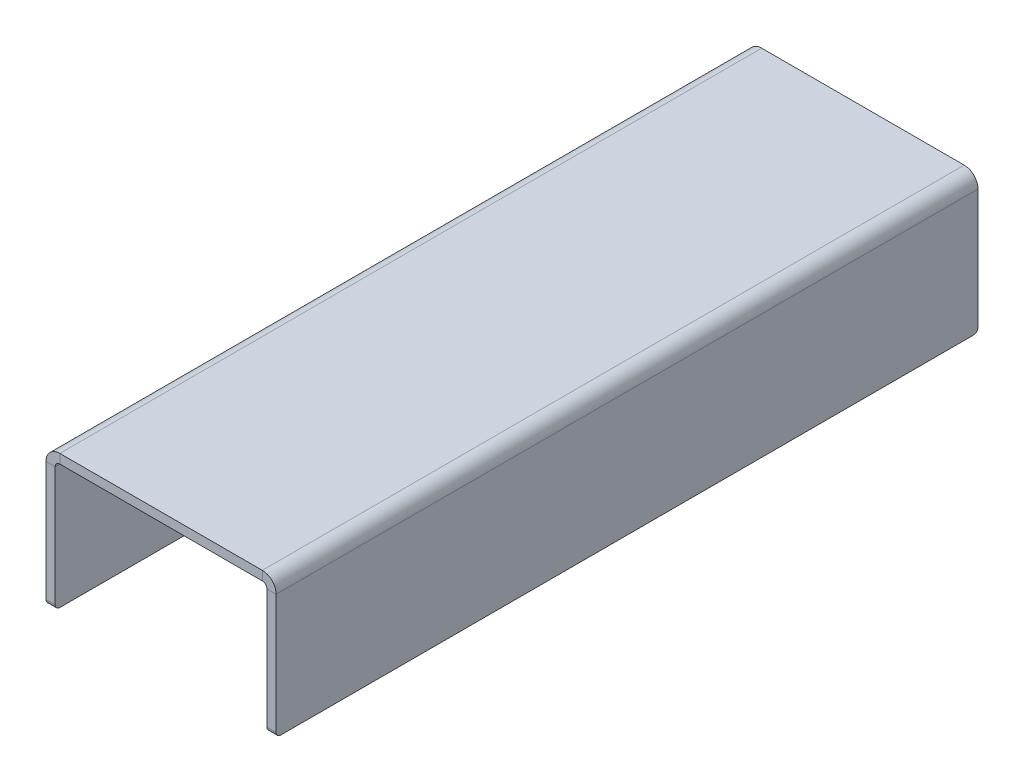
ISO-10303-21;
HEADER;
FILE_DESCRIPTION(('STEP AP214'),'2;1');
FILE_NAME('part.step','',(''),(''),'','','');
FILE_SCHEMA(('AUTOMOTIVE_DESIGN { 1 0 10303 214 1 1 1 1 }'));
ENDSEC;
DATA;
#1=APPLICATION_CONTEXT('core data for automotive mechanical design processes');
#2=APPLICATION_PROTOCOL_DEFINITION('international standard','automotive_design',2000,#1);
#3=PRODUCT_CONTEXT('',#1,'mechanical');
#4=PRODUCT('Part','Part','',(#3));
#5=PRODUCT_RELATED_PRODUCT_CATEGORY('part','',(#4));
#6=PRODUCT_DEFINITION_FORMATION('','',#4);
#7=PRODUCT_DEFINITION_CONTEXT('part definition',#1,'design');
#8=PRODUCT_DEFINITION('design','',#6,#7);
#9=PRODUCT_DEFINITION_SHAPE('','',#8);
#10=(LENGTH_UNIT() NAMED_UNIT(*) SI_UNIT(.MILLI.,.METRE.));
#11=(NAMED_UNIT(*) PLANE_ANGLE_UNIT() SI_UNIT($,.RADIAN.));
#12=(NAMED_UNIT(*) SI_UNIT($,.STERADIAN.) SOLID_ANGLE_UNIT());
#13=UNCERTAINTY_MEASURE_WITH_UNIT(LENGTH_MEASURE(1.E-05),#10,'distance_accuracy_value','');
#14=(GEOMETRIC_REPRESENTATION_CONTEXT(3) GLOBAL_UNCERTAINTY_ASSIGNED_CONTEXT((#13)) GLOBAL_UNIT_ASSIGNED_CONTEXT((#10,
#11,#12)) REPRESENTATION_CONTEXT('',''));
#15=CARTESIAN_POINT('',(0.,0.,0.));
#16=DIRECTION('',(0.,0.,1.));
#17=DIRECTION('',(1.,0.,0.));
#18=AXIS2_PLACEMENT_3D('',#15,#16,#17);
#19=CARTESIAN_POINT('',(-50.,-4.,152.5));
#20=DIRECTION('',(0.,0.,1.));
#21=DIRECTION('',(1.,0.,0.));
#22=AXIS2_PLACEMENT_3D('',#19,#20,#21);
#23=PLANE('',#22);
#24=DIRECTION('',(0.,-1.,0.));
#25=VECTOR('',#24,1.);
#26=CARTESIAN_POINT('',(44.,-4.,152.5));
#27=LINE('',#26,#25);
#28=CARTESIAN_POINT('',(44.,0.,152.5));
#29=VERTEX_POINT('',#28);
#30=CARTESIAN_POINT('',(44.,-4.,152.5));
#31=VERTEX_POINT('',#30);
#32=EDGE_CURVE('E261',#29,#31,#27,.T.);
#33=ORIENTED_EDGE('',*,*,#32,.F.);
#34=DIRECTION('',(1.,0.,0.));
#35=VECTOR('',#34,1.);
#36=CARTESIAN_POINT('',(-50.,0.,152.5));
#37=LINE('',#36,#35);
#38=CARTESIAN_POINT('',(-44.,0.,152.5));
#39=VERTEX_POINT('',#38);
#40=EDGE_CURVE('E236',#39,#29,#37,.T.);
#41=ORIENTED_EDGE('',*,*,#40,.F.);
#42=DIRECTION('',(0.,-1.,0.));
#43=VECTOR('',#42,1.);
#44=CARTESIAN_POINT('',(-44.,-4.,152.5));
#45=LINE('',#44,#43);
#46=CARTESIAN_POINT('',(-44.,-4.,152.5));
#47=VERTEX_POINT('',#46);
#48=EDGE_CURVE('E259',#39,#47,#45,.T.);
#49=ORIENTED_EDGE('',*,*,#48,.T.);
#50=DIRECTION('',(1.,0.,0.));
#51=VECTOR('',#50,1.);
#52=CARTESIAN_POINT('',(-50.,-4.,152.5));
#53=LINE('',#52,#51);
#54=EDGE_CURVE('E186',#47,#31,#53,.T.);
#55=ORIENTED_EDGE('',*,*,#54,.T.);
#56=EDGE_LOOP('',(#33,#41,#49,#55));
#57=FACE_BOUND('',#56,.T.);
#58=ADVANCED_FACE('F38',(#57),#23,.T.);
#59=CARTESIAN_POINT('',(-44.,-6.,152.5));
#60=DIRECTION('',(0.,0.,1.));
#61=DIRECTION('',(1.,0.,0.));
#62=AXIS2_PLACEMENT_3D('',#59,#60,#61);
#63=PLANE('',#62);
#64=ORIENTED_EDGE('',*,*,#48,.F.);
#65=CARTESIAN_POINT('',(-44.,-6.,152.5));
#66=DIRECTION('',(0.,0.,1.));
#67=DIRECTION('',(1.,0.,0.));
#68=AXIS2_PLACEMENT_3D('',#65,#66,#67);
#69=CIRCLE('',#68,6.);
#70=CARTESIAN_POINT('',(-50.,-5.99999999999999,152.5));
#71=VERTEX_POINT('',#70);
#72=EDGE_CURVE('E237',#39,#71,#69,.T.);
#73=ORIENTED_EDGE('',*,*,#72,.T.);
#74=DIRECTION('',(1.,0.,0.));
#75=VECTOR('',#74,1.);
#76=CARTESIAN_POINT('',(-46.,-6.,152.5));
#77=LINE('',#76,#75);
#78=CARTESIAN_POINT('',(-46.,-6.,152.5));
#79=VERTEX_POINT('',#78);
#80=EDGE_CURVE('E256',#71,#79,#77,.T.);
#81=ORIENTED_EDGE('',*,*,#80,.T.);
#82=CARTESIAN_POINT('',(-44.,-6.,152.5));
#83=DIRECTION('',(0.,0.,-1.));
#84=DIRECTION('',(-1.,0.,0.));
#85=AXIS2_PLACEMENT_3D('',#82,#83,#84);
#86=CIRCLE('',#85,2.);
#87=EDGE_CURVE('E177',#47,#79,#86,.F.);
#88=ORIENTED_EDGE('',*,*,#87,.F.);
#89=EDGE_LOOP('',(#64,#73,#81,#88));
#90=FACE_BOUND('',#89,.T.);
#91=ADVANCED_FACE('F348',(#90),#63,.T.);
#92=CARTESIAN_POINT('',(-46.,-60.,152.5));
#93=DIRECTION('',(0.,0.,1.));
#94=DIRECTION('',(0.,1.,0.));
#95=AXIS2_PLACEMENT_3D('',#92,#93,#94);
#96=PLANE('',#95);
#97=DIRECTION('',(0.,1.,0.));
#98=VECTOR('',#97,1.);
#99=CARTESIAN_POINT('',(-50.,-60.,152.5));
#100=LINE('',#99,#98);
#101=CARTESIAN_POINT('',(-50.,-58.,152.5));
#102=VERTEX_POINT('',#101);
#103=EDGE_CURVE('E241',#102,#71,#100,.T.);
#104=ORIENTED_EDGE('',*,*,#103,.F.);
#105=DIRECTION('',(-1.,0.,0.));
#106=VECTOR('',#105,1.);
#107=CARTESIAN_POINT('',(-46.,-58.,152.5));
#108=LINE('',#107,#106);
#109=CARTESIAN_POINT('',(-46.,-58.,152.5));
#110=VERTEX_POINT('',#109);
#111=EDGE_CURVE('E11',#102,#110,#108,.F.);
#112=ORIENTED_EDGE('',*,*,#111,.T.);
#113=DIRECTION('',(0.,1.,0.));
#114=VECTOR('',#113,1.);
#115=CARTESIAN_POINT('',(-46.,-60.,152.5));
#116=LINE('',#115,#114);
#117=EDGE_CURVE('E316',#110,#79,#116,.T.);
#118=ORIENTED_EDGE('',*,*,#117,.T.);
#119=ORIENTED_EDGE('',*,*,#80,.F.);
#120=EDGE_LOOP('',(#104,#112,#118,#119));
#121=FACE_BOUND('',#120,.T.);
#122=ADVANCED_FACE('F366',(#121),#96,.T.);
#123=CARTESIAN_POINT('',(-46.,-60.,152.5));
#124=DIRECTION('',(0.,1.,0.));
#125=DIRECTION('',(0.,0.,-1.));
#126=AXIS2_PLACEMENT_3D('',#123,#124,#125);
#127=PLANE('',#126);
#128=DIRECTION('',(0.,0.,1.));
#129=VECTOR('',#128,1.);
#130=CARTESIAN_POINT('',(-50.,-60.,152.5));
#131=LINE('',#130,#129);
#132=CARTESIAN_POINT('',(-50.,-60.,150.5));
#133=VERTEX_POINT('',#132);
#134=CARTESIAN_POINT('',(-50.,-60.,-150.5));
#135=VERTEX_POINT('',#134);
#136=EDGE_CURVE('E229',#133,#135,#131,.F.);
#137=ORIENTED_EDGE('',*,*,#136,.T.);
#138=DIRECTION('',(-1.,0.,0.));
#139=VECTOR('',#138,1.);
#140=CARTESIAN_POINT('',(-46.,-60.,-150.5));
#141=LINE('',#140,#139);
#142=CARTESIAN_POINT('',(-46.,-60.,-150.5));
#143=VERTEX_POINT('',#142);
#144=EDGE_CURVE('E266',#135,#143,#141,.F.);
#145=ORIENTED_EDGE('',*,*,#144,.T.);
#146=DIRECTION('',(0.,0.,-1.));
#147=VECTOR('',#146,1.);
#148=CARTESIAN_POINT('',(-46.,-60.,152.5));
#149=LINE('',#148,#147);
#150=CARTESIAN_POINT('',(-46.,-60.,150.5));
#151=VERTEX_POINT('',#150);
#152=EDGE_CURVE('E311',#151,#143,#149,.T.);
#153=ORIENTED_EDGE('',*,*,#152,.F.);
#154=DIRECTION('',(1.,0.,0.));
#155=VECTOR('',#154,1.);
#156=CARTESIAN_POINT('',(-46.,-60.,150.5));
#157=LINE('',#156,#155);
#158=EDGE_CURVE('E263',#151,#133,#157,.F.);
#159=ORIENTED_EDGE('',*,*,#158,.T.);
#160=EDGE_LOOP('',(#137,#145,#153,#159));
#161=FACE_BOUND('',#160,.T.);
#162=ADVANCED_FACE('F371',(#161),#127,.F.);
#163=CARTESIAN_POINT('',(-46.,-60.,-152.5));
#164=DIRECTION('',(0.,0.,1.));
#165=DIRECTION('',(0.,1.,0.));
#166=AXIS2_PLACEMENT_3D('',#163,#164,#165);
#167=PLANE('',#166);
#168=DIRECTION('',(0.,1.,0.));
#169=VECTOR('',#168,1.);
#170=CARTESIAN_POINT('',(-46.,-60.,-152.5));
#171=LINE('',#170,#169);
#172=CARTESIAN_POINT('',(-46.,-58.,-152.5));
#173=VERTEX_POINT('',#172);
#174=CARTESIAN_POINT('',(-46.,-6.,-152.5));
#175=VERTEX_POINT('',#174);
#176=EDGE_CURVE('E318',#173,#175,#171,.T.);
#177=ORIENTED_EDGE('',*,*,#176,.F.);
#178=DIRECTION('',(-1.,0.,0.));
#179=VECTOR('',#178,1.);
#180=CARTESIAN_POINT('',(-46.,-58.,-152.5));
#181=LINE('',#180,#179);
#182=CARTESIAN_POINT('',(-50.,-58.,-152.5));
#183=VERTEX_POINT('',#182);
#184=EDGE_CURVE('E273',#173,#183,#181,.T.);
#185=ORIENTED_EDGE('',*,*,#184,.T.);
#186=DIRECTION('',(0.,1.,0.));
#187=VECTOR('',#186,1.);
#188=CARTESIAN_POINT('',(-50.,-60.,-152.5));
#189=LINE('',#188,#187);
#190=CARTESIAN_POINT('',(-50.,-6.,-152.5));
#191=VERTEX_POINT('',#190);
#192=EDGE_CURVE('E239',#183,#191,#189,.T.);
#193=ORIENTED_EDGE('',*,*,#192,.T.);
#194=DIRECTION('',(1.,0.,0.));
#195=VECTOR('',#194,1.);
#196=CARTESIAN_POINT('',(-46.,-6.,-152.5));
#197=LINE('',#196,#195);
#198=EDGE_CURVE('E166',#191,#175,#197,.T.);
#199=ORIENTED_EDGE('',*,*,#198,.T.);
#200=EDGE_LOOP('',(#177,#185,#193,#199));
#201=FACE_BOUND('',#200,.T.);
#202=ADVANCED_FACE('F356',(#201),#167,.F.);
#203=CARTESIAN_POINT('',(-44.,-6.,-152.5));
#204=DIRECTION('',(0.,0.,-1.));
#205=DIRECTION('',(-1.,0.,0.));
#206=AXIS2_PLACEMENT_3D('',#203,#204,#205);
#207=PLANE('',#206);
#208=ORIENTED_EDGE('',*,*,#198,.F.);
#209=CARTESIAN_POINT('',(-44.,-6.,-152.5));
#210=DIRECTION('',(0.,0.,1.));
#211=DIRECTION('',(1.,0.,0.));
#212=AXIS2_PLACEMENT_3D('',#209,#210,#211);
#213=CIRCLE('',#212,6.);
#214=CARTESIAN_POINT('',(-44.,0.,-152.5));
#215=VERTEX_POINT('',#214);
#216=EDGE_CURVE('E161',#191,#215,#213,.F.);
#217=ORIENTED_EDGE('',*,*,#216,.T.);
#218=DIRECTION('',(0.,-1.,0.));
#219=VECTOR('',#218,1.);
#220=CARTESIAN_POINT('',(-44.,-4.,-152.5));
#221=LINE('',#220,#219);
#222=CARTESIAN_POINT('',(-44.,-4.,-152.5));
#223=VERTEX_POINT('',#222);
#224=EDGE_CURVE('E154',#215,#223,#221,.T.);
#225=ORIENTED_EDGE('',*,*,#224,.T.);
#226=CARTESIAN_POINT('',(-44.,-6.,-152.5));
#227=DIRECTION('',(0.,0.,1.));
#228=DIRECTION('',(1.,0.,0.));
#229=AXIS2_PLACEMENT_3D('',#226,#227,#228);
#230=CIRCLE('',#229,2.);
#231=EDGE_CURVE('E158',#175,#223,#230,.F.);
#232=ORIENTED_EDGE('',*,*,#231,.F.);
#233=EDGE_LOOP('',(#208,#217,#225,#232));
#234=FACE_BOUND('',#233,.T.);
#235=ADVANCED_FACE('F157',(#234),#207,.T.);
#236=CARTESIAN_POINT('',(-50.,-4.,-152.5));
#237=DIRECTION('',(0.,0.,1.));
#238=DIRECTION('',(1.,0.,0.));
#239=AXIS2_PLACEMENT_3D('',#236,#237,#238);
#240=PLANE('',#239);
#241=ORIENTED_EDGE('',*,*,#224,.F.);
#242=DIRECTION('',(1.,0.,0.));
#243=VECTOR('',#242,1.);
#244=CARTESIAN_POINT('',(-50.,0.,-152.5));
#245=LINE('',#244,#243);
#246=CARTESIAN_POINT('',(44.,0.,-152.5));
#247=VERTEX_POINT('',#246);
#248=EDGE_CURVE('E234',#215,#247,#245,.T.);
#249=ORIENTED_EDGE('',*,*,#248,.T.);
#250=DIRECTION('',(0.,-1.,0.));
#251=VECTOR('',#250,1.);
#252=CARTESIAN_POINT('',(44.,-4.,-152.5));
#253=LINE('',#252,#251);
#254=CARTESIAN_POINT('',(44.,-4.,-152.5));
#255=VERTEX_POINT('',#254);
#256=EDGE_CURVE('E167',#247,#255,#253,.T.);
#257=ORIENTED_EDGE('',*,*,#256,.T.);
#258=DIRECTION('',(1.,0.,0.));
#259=VECTOR('',#258,1.);
#260=CARTESIAN_POINT('',(-50.,-4.,-152.5));
#261=LINE('',#260,#259);
#262=EDGE_CURVE('E181',#223,#255,#261,.T.);
#263=ORIENTED_EDGE('',*,*,#262,.F.);
#264=EDGE_LOOP('',(#241,#249,#257,#263));
#265=FACE_BOUND('',#264,.T.);
#266=ADVANCED_FACE('F182',(#265),#240,.F.);
#267=CARTESIAN_POINT('',(44.,-6.,-152.5));
#268=DIRECTION('',(0.,0.,1.));
#269=DIRECTION('',(1.,0.,0.));
#270=AXIS2_PLACEMENT_3D('',#267,#268,#269);
#271=PLANE('',#270);
#272=ORIENTED_EDGE('',*,*,#256,.F.);
#273=CARTESIAN_POINT('',(44.,-6.,-152.5));
#274=DIRECTION('',(0.,0.,1.));
#275=DIRECTION('',(1.,0.,0.));
#276=AXIS2_PLACEMENT_3D('',#273,#274,#275);
#277=CIRCLE('',#276,6.);
#278=CARTESIAN_POINT('',(50.,-6.,-152.5));
#279=VERTEX_POINT('',#278);
#280=EDGE_CURVE('E230',#247,#279,#277,.F.);
#281=ORIENTED_EDGE('',*,*,#280,.T.);
#282=DIRECTION('',(-1.,0.,0.));
#283=VECTOR('',#282,1.);
#284=CARTESIAN_POINT('',(46.,-6.,-152.5));
#285=LINE('',#284,#283);
#286=CARTESIAN_POINT('',(46.,-6.,-152.5));
#287=VERTEX_POINT('',#286);
#288=EDGE_CURVE('E251',#279,#287,#285,.T.);
#289=ORIENTED_EDGE('',*,*,#288,.T.);
#290=CARTESIAN_POINT('',(44.,-6.,-152.5));
#291=DIRECTION('',(0.,0.,-1.));
#292=DIRECTION('',(-1.,0.,0.));
#293=AXIS2_PLACEMENT_3D('',#290,#291,#292);
#294=CIRCLE('',#293,2.);
#295=EDGE_CURVE('E206',#255,#287,#294,.T.);
#296=ORIENTED_EDGE('',*,*,#295,.F.);
#297=EDGE_LOOP('',(#272,#281,#289,#296));
#298=FACE_BOUND('',#297,.T.);
#299=ADVANCED_FACE('F406',(#298),#271,.F.);
#300=CARTESIAN_POINT('',(46.,0.,-152.5));
#301=DIRECTION('',(0.,0.,-1.));
#302=DIRECTION('',(0.,1.,0.));
#303=AXIS2_PLACEMENT_3D('',#300,#301,#302);
#304=PLANE('',#303);
#305=DIRECTION('',(0.,1.,0.));
#306=VECTOR('',#305,1.);
#307=CARTESIAN_POINT('',(50.,0.,-152.5));
#308=LINE('',#307,#306);
#309=CARTESIAN_POINT('',(50.,-58.,-152.5));
#310=VERTEX_POINT('',#309);
#311=EDGE_CURVE('E226',#279,#310,#308,.F.);
#312=ORIENTED_EDGE('',*,*,#311,.T.);
#313=DIRECTION('',(-1.,0.,0.));
#314=VECTOR('',#313,1.);
#315=CARTESIAN_POINT('',(46.,-58.,-152.5));
#316=LINE('',#315,#314);
#317=CARTESIAN_POINT('',(46.,-58.,-152.5));
#318=VERTEX_POINT('',#317);
#319=EDGE_CURVE('E279',#310,#318,#316,.T.);
#320=ORIENTED_EDGE('',*,*,#319,.T.);
#321=DIRECTION('',(0.,1.,0.));
#322=VECTOR('',#321,1.);
#323=CARTESIAN_POINT('',(46.,0.,-152.5));
#324=LINE('',#323,#322);
#325=EDGE_CURVE('E308',#287,#318,#324,.F.);
#326=ORIENTED_EDGE('',*,*,#325,.F.);
#327=ORIENTED_EDGE('',*,*,#288,.F.);
#328=EDGE_LOOP('',(#312,#320,#326,#327));
#329=FACE_BOUND('',#328,.T.);
#330=ADVANCED_FACE('F301',(#329),#304,.T.);
#331=CARTESIAN_POINT('',(46.,-60.,152.5));
#332=DIRECTION('',(0.,-1.,0.));
#333=DIRECTION('',(0.,0.,-1.));
#334=AXIS2_PLACEMENT_3D('',#331,#332,#333);
#335=PLANE('',#334);
#336=DIRECTION('',(0.,0.,-1.));
#337=VECTOR('',#336,1.);
#338=CARTESIAN_POINT('',(46.,-60.,152.5));
#339=LINE('',#338,#337);
#340=CARTESIAN_POINT('',(46.,-60.,150.5));
#341=VERTEX_POINT('',#340);
#342=CARTESIAN_POINT('',(46.,-60.,-150.5));
#343=VERTEX_POINT('',#342);
#344=EDGE_CURVE('E196',#341,#343,#339,.T.);
#345=ORIENTED_EDGE('',*,*,#344,.T.);
#346=DIRECTION('',(-1.,0.,0.));
#347=VECTOR('',#346,1.);
#348=CARTESIAN_POINT('',(46.,-60.,-150.5));
#349=LINE('',#348,#347);
#350=CARTESIAN_POINT('',(50.,-60.,-150.5));
#351=VERTEX_POINT('',#350);
#352=EDGE_CURVE('E60',#343,#351,#349,.F.);
#353=ORIENTED_EDGE('',*,*,#352,.T.);
#354=DIRECTION('',(0.,0.,-1.));
#355=VECTOR('',#354,1.);
#356=CARTESIAN_POINT('',(50.,-60.,152.5));
#357=LINE('',#356,#355);
#358=CARTESIAN_POINT('',(50.,-60.,150.5));
#359=VERTEX_POINT('',#358);
#360=EDGE_CURVE('E224',#359,#351,#357,.T.);
#361=ORIENTED_EDGE('',*,*,#360,.F.);
#362=DIRECTION('',(1.,0.,0.));
#363=VECTOR('',#362,1.);
#364=CARTESIAN_POINT('',(46.,-60.,150.5));
#365=LINE('',#364,#363);
#366=EDGE_CURVE('E286',#359,#341,#365,.F.);
#367=ORIENTED_EDGE('',*,*,#366,.T.);
#368=EDGE_LOOP('',(#345,#353,#361,#367));
#369=FACE_BOUND('',#368,.T.);
#370=ADVANCED_FACE('F309',(#369),#335,.T.);
#371=CARTESIAN_POINT('',(46.,0.,152.5));
#372=DIRECTION('',(0.,0.,-1.));
#373=DIRECTION('',(0.,1.,0.));
#374=AXIS2_PLACEMENT_3D('',#371,#372,#373);
#375=PLANE('',#374);
#376=DIRECTION('',(0.,1.,0.));
#377=VECTOR('',#376,1.);
#378=CARTESIAN_POINT('',(46.,0.,152.5));
#379=LINE('',#378,#377);
#380=CARTESIAN_POINT('',(46.,-6.,152.5));
#381=VERTEX_POINT('',#380);
#382=CARTESIAN_POINT('',(46.,-58.,152.5));
#383=VERTEX_POINT('',#382);
#384=EDGE_CURVE('E192',#381,#383,#379,.F.);
#385=ORIENTED_EDGE('',*,*,#384,.T.);
#386=DIRECTION('',(-1.,0.,0.));
#387=VECTOR('',#386,1.);
#388=CARTESIAN_POINT('',(46.,-58.,152.5));
#389=LINE('',#388,#387);
#390=CARTESIAN_POINT('',(50.,-58.,152.5));
#391=VERTEX_POINT('',#390);
#392=EDGE_CURVE('E46',#383,#391,#389,.F.);
#393=ORIENTED_EDGE('',*,*,#392,.T.);
#394=DIRECTION('',(0.,1.,0.));
#395=VECTOR('',#394,1.);
#396=CARTESIAN_POINT('',(50.,0.,152.5));
#397=LINE('',#396,#395);
#398=CARTESIAN_POINT('',(50.,-6.,152.5));
#399=VERTEX_POINT('',#398);
#400=EDGE_CURVE('E220',#399,#391,#397,.F.);
#401=ORIENTED_EDGE('',*,*,#400,.F.);
#402=DIRECTION('',(-1.,0.,0.));
#403=VECTOR('',#402,1.);
#404=CARTESIAN_POINT('',(46.,-6.,152.5));
#405=LINE('',#404,#403);
#406=EDGE_CURVE('E205',#399,#381,#405,.T.);
#407=ORIENTED_EDGE('',*,*,#406,.T.);
#408=EDGE_LOOP('',(#385,#393,#401,#407));
#409=FACE_BOUND('',#408,.T.);
#410=ADVANCED_FACE('F330',(#409),#375,.F.);
#411=CARTESIAN_POINT('',(44.,-6.,152.5));
#412=DIRECTION('',(0.,0.,-1.));
#413=DIRECTION('',(-1.,0.,0.));
#414=AXIS2_PLACEMENT_3D('',#411,#412,#413);
#415=PLANE('',#414);
#416=CARTESIAN_POINT('',(44.,-6.,152.5));
#417=DIRECTION('',(0.,0.,1.));
#418=DIRECTION('',(1.,0.,0.));
#419=AXIS2_PLACEMENT_3D('',#416,#417,#418);
#420=CIRCLE('',#419,6.);
#421=EDGE_CURVE('E233',#399,#29,#420,.T.);
#422=ORIENTED_EDGE('',*,*,#421,.T.);
#423=ORIENTED_EDGE('',*,*,#32,.T.);
#424=CARTESIAN_POINT('',(44.,-6.,152.5));
#425=DIRECTION('',(0.,0.,1.));
#426=DIRECTION('',(1.,0.,0.));
#427=AXIS2_PLACEMENT_3D('',#424,#425,#426);
#428=CIRCLE('',#427,2.);
#429=EDGE_CURVE('E178',#381,#31,#428,.T.);
#430=ORIENTED_EDGE('',*,*,#429,.F.);
#431=ORIENTED_EDGE('',*,*,#406,.F.);
#432=EDGE_LOOP('',(#422,#423,#430,#431));
#433=FACE_BOUND('',#432,.T.);
#434=ADVANCED_FACE('F329',(#433),#415,.F.);
#435=CARTESIAN_POINT('',(46.,0.,152.5));
#436=DIRECTION('',(1.,0.,0.));
#437=DIRECTION('',(0.,0.,-1.));
#438=AXIS2_PLACEMENT_3D('',#435,#436,#437);
#439=PLANE('',#438);
#440=ORIENTED_EDGE('',*,*,#325,.T.);
#441=CARTESIAN_POINT('',(46.,-58.,-150.5));
#442=DIRECTION('',(1.,0.,0.));
#443=DIRECTION('',(0.,0.,-1.));
#444=AXIS2_PLACEMENT_3D('',#441,#442,#443);
#445=CIRCLE('',#444,2.);
#446=EDGE_CURVE('E284',#318,#343,#445,.F.);
#447=ORIENTED_EDGE('',*,*,#446,.T.);
#448=ORIENTED_EDGE('',*,*,#344,.F.);
#449=CARTESIAN_POINT('',(46.,-58.,150.5));
#450=DIRECTION('',(1.,0.,0.));
#451=DIRECTION('',(0.,0.,-1.));
#452=AXIS2_PLACEMENT_3D('',#449,#450,#451);
#453=CIRCLE('',#452,2.);
#454=EDGE_CURVE('E282',#341,#383,#453,.F.);
#455=ORIENTED_EDGE('',*,*,#454,.T.);
#456=ORIENTED_EDGE('',*,*,#384,.F.);
#457=DIRECTION('',(0.,0.,-1.));
#458=VECTOR('',#457,1.);
#459=CARTESIAN_POINT('',(46.,-6.,-152.5));
#460=LINE('',#459,#458);
#461=EDGE_CURVE('E194',#381,#287,#460,.T.);
#462=ORIENTED_EDGE('',*,*,#461,.T.);
#463=EDGE_LOOP('',(#440,#447,#448,#455,#456,#462));
#464=FACE_BOUND('',#463,.T.);
#465=ADVANCED_FACE('F307',(#464),#439,.F.);
#466=CARTESIAN_POINT('',(-46.,-60.,152.5));
#467=DIRECTION('',(-1.,0.,0.));
#468=DIRECTION('',(0.,0.,1.));
#469=AXIS2_PLACEMENT_3D('',#466,#467,#468);
#470=PLANE('',#469);
#471=ORIENTED_EDGE('',*,*,#152,.T.);
#472=CARTESIAN_POINT('',(-46.,-58.,-150.5));
#473=DIRECTION('',(-1.,0.,0.));
#474=DIRECTION('',(0.,0.,1.));
#475=AXIS2_PLACEMENT_3D('',#472,#473,#474);
#476=CIRCLE('',#475,2.);
#477=EDGE_CURVE('E271',#143,#173,#476,.F.);
#478=ORIENTED_EDGE('',*,*,#477,.T.);
#479=ORIENTED_EDGE('',*,*,#176,.T.);
#480=DIRECTION('',(0.,0.,-1.));
#481=VECTOR('',#480,1.);
#482=CARTESIAN_POINT('',(-46.,-6.,152.5));
#483=LINE('',#482,#481);
#484=EDGE_CURVE('E176',#175,#79,#483,.F.);
#485=ORIENTED_EDGE('',*,*,#484,.T.);
#486=ORIENTED_EDGE('',*,*,#117,.F.);
#487=CARTESIAN_POINT('',(-46.,-58.,150.5));
#488=DIRECTION('',(-1.,0.,0.));
#489=DIRECTION('',(0.,0.,1.));
#490=AXIS2_PLACEMENT_3D('',#487,#488,#489);
#491=CIRCLE('',#490,2.);
#492=EDGE_CURVE('E269',#110,#151,#491,.F.);
#493=ORIENTED_EDGE('',*,*,#492,.T.);
#494=EDGE_LOOP('',(#471,#478,#479,#485,#486,#493));
#495=FACE_BOUND('',#494,.T.);
#496=ADVANCED_FACE('F352',(#495),#470,.F.);
#497=CARTESIAN_POINT('',(-50.,-4.,152.5));
#498=DIRECTION('',(0.,1.,0.));
#499=DIRECTION('',(0.,0.,1.));
#500=AXIS2_PLACEMENT_3D('',#497,#498,#499);
#501=PLANE('',#500);
#502=ORIENTED_EDGE('',*,*,#262,.T.);
#503=DIRECTION('',(0.,0.,-1.));
#504=VECTOR('',#503,1.);
#505=CARTESIAN_POINT('',(44.,-4.,152.5));
#506=LINE('',#505,#504);
#507=EDGE_CURVE('E203',#255,#31,#506,.F.);
#508=ORIENTED_EDGE('',*,*,#507,.T.);
#509=ORIENTED_EDGE('',*,*,#54,.F.);
#510=DIRECTION('',(0.,0.,-1.));
#511=VECTOR('',#510,1.);
#512=CARTESIAN_POINT('',(-44.,-4.,-152.5));
#513=LINE('',#512,#511);
#514=EDGE_CURVE('E174',#47,#223,#513,.T.);
#515=ORIENTED_EDGE('',*,*,#514,.T.);
#516=EDGE_LOOP('',(#502,#508,#509,#515));
#517=FACE_BOUND('',#516,.T.);
#518=ADVANCED_FACE('F189',(#517),#501,.F.);
#519=CARTESIAN_POINT('',(-44.,-6.,152.5));
#520=DIRECTION('',(0.,0.,1.));
#521=DIRECTION('',(1.,0.,0.));
#522=AXIS2_PLACEMENT_3D('',#519,#520,#521);
#523=CYLINDRICAL_SURFACE('',#522,2.);
#524=ORIENTED_EDGE('',*,*,#87,.T.);
#525=ORIENTED_EDGE('',*,*,#484,.F.);
#526=ORIENTED_EDGE('',*,*,#231,.T.);
#527=ORIENTED_EDGE('',*,*,#514,.F.);
#528=EDGE_LOOP('',(#524,#525,#526,#527));
#529=FACE_BOUND('',#528,.T.);
#530=ADVANCED_FACE('F172',(#529),#523,.F.);
#531=CARTESIAN_POINT('',(44.,-6.,152.5));
#532=DIRECTION('',(0.,0.,1.));
#533=DIRECTION('',(1.,0.,0.));
#534=AXIS2_PLACEMENT_3D('',#531,#532,#533);
#535=CYLINDRICAL_SURFACE('',#534,2.);
#536=ORIENTED_EDGE('',*,*,#429,.T.);
#537=ORIENTED_EDGE('',*,*,#507,.F.);
#538=ORIENTED_EDGE('',*,*,#295,.T.);
#539=ORIENTED_EDGE('',*,*,#461,.F.);
#540=EDGE_LOOP('',(#536,#537,#538,#539));
#541=FACE_BOUND('',#540,.T.);
#542=ADVANCED_FACE('F324',(#541),#535,.F.);
#543=CARTESIAN_POINT('',(50.,0.,152.5));
#544=DIRECTION('',(1.,0.,0.));
#545=DIRECTION('',(0.,0.,-1.));
#546=AXIS2_PLACEMENT_3D('',#543,#544,#545);
#547=PLANE('',#546);
#548=ORIENTED_EDGE('',*,*,#360,.T.);
#549=CARTESIAN_POINT('',(50.,-58.,-150.5));
#550=DIRECTION('',(1.,0.,0.));
#551=DIRECTION('',(0.,0.,-1.));
#552=AXIS2_PLACEMENT_3D('',#549,#550,#551);
#553=CIRCLE('',#552,2.);
#554=EDGE_CURVE('E292',#351,#310,#553,.T.);
#555=ORIENTED_EDGE('',*,*,#554,.T.);
#556=ORIENTED_EDGE('',*,*,#311,.F.);
#557=DIRECTION('',(0.,0.,-1.));
#558=VECTOR('',#557,1.);
#559=CARTESIAN_POINT('',(50.,-6.,152.5));
#560=LINE('',#559,#558);
#561=EDGE_CURVE('E212',#399,#279,#560,.T.);
#562=ORIENTED_EDGE('',*,*,#561,.F.);
#563=ORIENTED_EDGE('',*,*,#400,.T.);
#564=CARTESIAN_POINT('',(50.,-58.,150.5));
#565=DIRECTION('',(1.,0.,0.));
#566=DIRECTION('',(0.,0.,-1.));
#567=AXIS2_PLACEMENT_3D('',#564,#565,#566);
#568=CIRCLE('',#567,2.);
#569=EDGE_CURVE('E290',#391,#359,#568,.T.);
#570=ORIENTED_EDGE('',*,*,#569,.T.);
#571=EDGE_LOOP('',(#548,#555,#556,#562,#563,#570));
#572=FACE_BOUND('',#571,.T.);
#573=ADVANCED_FACE('F296',(#572),#547,.T.);
#574=CARTESIAN_POINT('',(-50.,-60.,152.5));
#575=DIRECTION('',(-1.,0.,0.));
#576=DIRECTION('',(0.,0.,1.));
#577=AXIS2_PLACEMENT_3D('',#574,#575,#576);
#578=PLANE('',#577);
#579=ORIENTED_EDGE('',*,*,#192,.F.);
#580=CARTESIAN_POINT('',(-50.,-58.,-150.5));
#581=DIRECTION('',(-1.,0.,0.));
#582=DIRECTION('',(0.,0.,1.));
#583=AXIS2_PLACEMENT_3D('',#580,#581,#582);
#584=CIRCLE('',#583,2.);
#585=EDGE_CURVE('E277',#183,#135,#584,.T.);
#586=ORIENTED_EDGE('',*,*,#585,.T.);
#587=ORIENTED_EDGE('',*,*,#136,.F.);
#588=CARTESIAN_POINT('',(-50.,-58.,150.5));
#589=DIRECTION('',(-1.,0.,0.));
#590=DIRECTION('',(0.,0.,1.));
#591=AXIS2_PLACEMENT_3D('',#588,#589,#590);
#592=CIRCLE('',#591,2.);
#593=EDGE_CURVE('E275',#133,#102,#592,.T.);
#594=ORIENTED_EDGE('',*,*,#593,.T.);
#595=ORIENTED_EDGE('',*,*,#103,.T.);
#596=DIRECTION('',(0.,0.,1.));
#597=VECTOR('',#596,1.);
#598=CARTESIAN_POINT('',(-50.,-6.,152.5));
#599=LINE('',#598,#597);
#600=EDGE_CURVE('E215',#191,#71,#599,.T.);
#601=ORIENTED_EDGE('',*,*,#600,.F.);
#602=EDGE_LOOP('',(#579,#586,#587,#594,#595,#601));
#603=FACE_BOUND('',#602,.T.);
#604=ADVANCED_FACE('F359',(#603),#578,.T.);
#605=CARTESIAN_POINT('',(-50.,0.,152.5));
#606=DIRECTION('',(0.,1.,0.));
#607=DIRECTION('',(0.,0.,1.));
#608=AXIS2_PLACEMENT_3D('',#605,#606,#607);
#609=PLANE('',#608);
#610=ORIENTED_EDGE('',*,*,#248,.F.);
#611=DIRECTION('',(0.,0.,1.));
#612=VECTOR('',#611,1.);
#613=CARTESIAN_POINT('',(-44.,0.,152.5));
#614=LINE('',#613,#612);
#615=EDGE_CURVE('E218',#39,#215,#614,.F.);
#616=ORIENTED_EDGE('',*,*,#615,.F.);
#617=ORIENTED_EDGE('',*,*,#40,.T.);
#618=DIRECTION('',(0.,0.,1.));
#619=VECTOR('',#618,1.);
#620=CARTESIAN_POINT('',(44.,0.,152.5));
#621=LINE('',#620,#619);
#622=EDGE_CURVE('E209',#247,#29,#621,.T.);
#623=ORIENTED_EDGE('',*,*,#622,.F.);
#624=EDGE_LOOP('',(#610,#616,#617,#623));
#625=FACE_BOUND('',#624,.T.);
#626=ADVANCED_FACE('F342',(#625),#609,.T.);
#627=CARTESIAN_POINT('',(-44.,-6.,152.5));
#628=DIRECTION('',(0.,0.,1.));
#629=DIRECTION('',(1.,0.,0.));
#630=AXIS2_PLACEMENT_3D('',#627,#628,#629);
#631=CYLINDRICAL_SURFACE('',#630,6.);
#632=ORIENTED_EDGE('',*,*,#72,.F.);
#633=ORIENTED_EDGE('',*,*,#615,.T.);
#634=ORIENTED_EDGE('',*,*,#216,.F.);
#635=ORIENTED_EDGE('',*,*,#600,.T.);
#636=EDGE_LOOP('',(#632,#633,#634,#635));
#637=FACE_BOUND('',#636,.T.);
#638=ADVANCED_FACE('F345',(#637),#631,.T.);
#639=CARTESIAN_POINT('',(44.,-6.,152.5));
#640=DIRECTION('',(0.,0.,1.));
#641=DIRECTION('',(1.,0.,0.));
#642=AXIS2_PLACEMENT_3D('',#639,#640,#641);
#643=CYLINDRICAL_SURFACE('',#642,6.);
#644=ORIENTED_EDGE('',*,*,#421,.F.);
#645=ORIENTED_EDGE('',*,*,#561,.T.);
#646=ORIENTED_EDGE('',*,*,#280,.F.);
#647=ORIENTED_EDGE('',*,*,#622,.T.);
#648=EDGE_LOOP('',(#644,#645,#646,#647));
#649=FACE_BOUND('',#648,.T.);
#650=ADVANCED_FACE('F337',(#649),#643,.T.);
#651=CARTESIAN_POINT('',(-46.,-58.,-150.5));
#652=DIRECTION('',(1.,0.,0.));
#653=DIRECTION('',(0.,0.,-1.));
#654=AXIS2_PLACEMENT_3D('',#651,#652,#653);
#655=CYLINDRICAL_SURFACE('',#654,2.);
#656=ORIENTED_EDGE('',*,*,#585,.F.);
#657=ORIENTED_EDGE('',*,*,#184,.F.);
#658=ORIENTED_EDGE('',*,*,#477,.F.);
#659=ORIENTED_EDGE('',*,*,#144,.F.);
#660=EDGE_LOOP('',(#656,#657,#658,#659));
#661=FACE_BOUND('',#660,.T.);
#662=ADVANCED_FACE('F374',(#661),#655,.T.);
#663=CARTESIAN_POINT('',(46.,-58.,-150.5));
#664=DIRECTION('',(-1.,0.,0.));
#665=DIRECTION('',(0.,0.,1.));
#666=AXIS2_PLACEMENT_3D('',#663,#664,#665);
#667=CYLINDRICAL_SURFACE('',#666,2.);
#668=ORIENTED_EDGE('',*,*,#554,.F.);
#669=ORIENTED_EDGE('',*,*,#352,.F.);
#670=ORIENTED_EDGE('',*,*,#446,.F.);
#671=ORIENTED_EDGE('',*,*,#319,.F.);
#672=EDGE_LOOP('',(#668,#669,#670,#671));
#673=FACE_BOUND('',#672,.T.);
#674=ADVANCED_FACE('F304',(#673),#667,.T.);
#675=CARTESIAN_POINT('',(46.,-58.,150.5));
#676=DIRECTION('',(1.,0.,0.));
#677=DIRECTION('',(0.,0.,-1.));
#678=AXIS2_PLACEMENT_3D('',#675,#676,#677);
#679=CYLINDRICAL_SURFACE('',#678,2.);
#680=ORIENTED_EDGE('',*,*,#569,.F.);
#681=ORIENTED_EDGE('',*,*,#392,.F.);
#682=ORIENTED_EDGE('',*,*,#454,.F.);
#683=ORIENTED_EDGE('',*,*,#366,.F.);
#684=EDGE_LOOP('',(#680,#681,#682,#683));
#685=FACE_BOUND('',#684,.T.);
#686=ADVANCED_FACE('F333',(#685),#679,.T.);
#687=CARTESIAN_POINT('',(-46.,-58.,150.5));
#688=DIRECTION('',(-1.,0.,0.));
#689=DIRECTION('',(0.,0.,1.));
#690=AXIS2_PLACEMENT_3D('',#687,#688,#689);
#691=CYLINDRICAL_SURFACE('',#690,2.);
#692=ORIENTED_EDGE('',*,*,#593,.F.);
#693=ORIENTED_EDGE('',*,*,#158,.F.);
#694=ORIENTED_EDGE('',*,*,#492,.F.);
#695=ORIENTED_EDGE('',*,*,#111,.F.);
#696=EDGE_LOOP('',(#692,#693,#694,#695));
#697=FACE_BOUND('',#696,.T.);
#698=ADVANCED_FACE('F40',(#697),#691,.T.);
#699=CLOSED_SHELL('',(#58,#91,#122,#162,#202,#235,#266,#299,#330,#370,#410,#434,#465,#496,#518,
#530,#542,#573,#604,#626,#638,#650,#662,#674,#686,#698));
#700=MANIFOLD_SOLID_BREP('B2',#699);
#701=ADVANCED_BREP_SHAPE_REPRESENTATION('',(#18,#700),#14);
#702=SHAPE_DEFINITION_REPRESENTATION(#9,#701);
ENDSEC;
END-ISO-10303-21;
